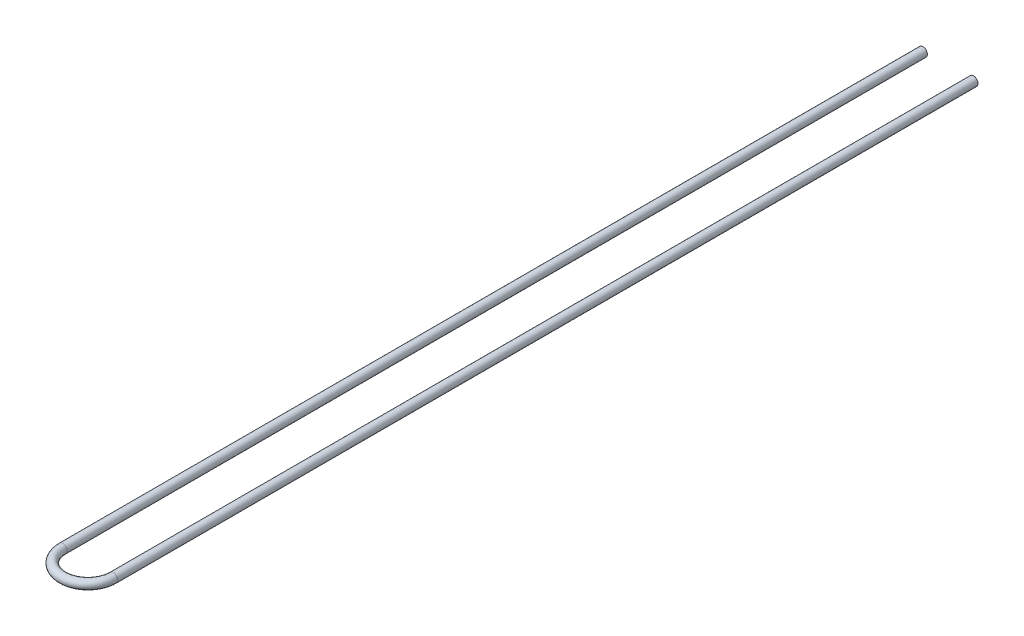
ISO-10303-21;
HEADER;
FILE_DESCRIPTION(('STEP AP214'),'2;1');
FILE_NAME('part.step','',(''),(''),'','','');
FILE_SCHEMA(('AUTOMOTIVE_DESIGN { 1 0 10303 214 1 1 1 1 }'));
ENDSEC;
DATA;
#1=APPLICATION_CONTEXT('core data for automotive mechanical design processes');
#2=APPLICATION_PROTOCOL_DEFINITION('international standard','automotive_design',2000,#1);
#3=PRODUCT_CONTEXT('',#1,'mechanical');
#4=PRODUCT('Part','Part','',(#3));
#5=PRODUCT_RELATED_PRODUCT_CATEGORY('part','',(#4));
#6=PRODUCT_DEFINITION_FORMATION('','',#4);
#7=PRODUCT_DEFINITION_CONTEXT('part definition',#1,'design');
#8=PRODUCT_DEFINITION('design','',#6,#7);
#9=PRODUCT_DEFINITION_SHAPE('','',#8);
#10=(LENGTH_UNIT() NAMED_UNIT(*) SI_UNIT(.MILLI.,.METRE.));
#11=(NAMED_UNIT(*) PLANE_ANGLE_UNIT() SI_UNIT($,.RADIAN.));
#12=(NAMED_UNIT(*) SI_UNIT($,.STERADIAN.) SOLID_ANGLE_UNIT());
#13=UNCERTAINTY_MEASURE_WITH_UNIT(LENGTH_MEASURE(1.E-05),#10,'distance_accuracy_value','');
#14=(GEOMETRIC_REPRESENTATION_CONTEXT(3) GLOBAL_UNCERTAINTY_ASSIGNED_CONTEXT((#13)) GLOBAL_UNIT_ASSIGNED_CONTEXT((#10,
#11,#12)) REPRESENTATION_CONTEXT('',''));
#15=CARTESIAN_POINT('',(0.,0.,0.));
#16=DIRECTION('',(0.,0.,1.));
#17=DIRECTION('',(1.,0.,0.));
#18=AXIS2_PLACEMENT_3D('',#15,#16,#17);
#19=CARTESIAN_POINT('',(-40.,0.,299.999999999999));
#20=DIRECTION('',(0.,0.,1.));
#21=DIRECTION('',(1.,0.,0.));
#22=AXIS2_PLACEMENT_3D('',#19,#20,#21);
#23=CYLINDRICAL_SURFACE('',#22,11.1);
#24=CARTESIAN_POINT('',(-39.9999999999997,0.,2440.));
#25=DIRECTION('',(0.,0.,1.));
#26=DIRECTION('',(1.,0.,0.));
#27=AXIS2_PLACEMENT_3D('',#24,#25,#26);
#28=CIRCLE('',#27,11.1);
#29=CARTESIAN_POINT('',(-51.0999999999997,0.,2440.));
#30=VERTEX_POINT('',#29);
#31=EDGE_CURVE('E52',#30,#30,#28,.T.);
#32=ORIENTED_EDGE('',*,*,#31,.F.);
#33=EDGE_LOOP('',(#32));
#34=FACE_BOUND('',#33,.T.);
#35=CARTESIAN_POINT('',(-40.,0.,299.999999999999));
#36=DIRECTION('',(0.,0.,1.));
#37=DIRECTION('',(1.,0.,0.));
#38=AXIS2_PLACEMENT_3D('',#35,#36,#37);
#39=CIRCLE('',#38,11.1);
#40=CARTESIAN_POINT('',(-28.9,0.,299.999999999999));
#41=VERTEX_POINT('',#40);
#42=EDGE_CURVE('E50',#41,#41,#39,.T.);
#43=ORIENTED_EDGE('',*,*,#42,.T.);
#44=EDGE_LOOP('',(#43));
#45=FACE_BOUND('',#44,.T.);
#46=ADVANCED_FACE('F29',(#34,#45),#23,.T.);
#47=CARTESIAN_POINT('',(22.9250000000003,0.,2440.));
#48=DIRECTION('',(0.,1.,0.));
#49=DIRECTION('',(0.,0.,1.));
#50=AXIS2_PLACEMENT_3D('',#47,#48,#49);
#51=TOROIDAL_SURFACE('',#50,62.925,11.1);
#52=CARTESIAN_POINT('',(85.8500000000003,0.,2440.));
#53=DIRECTION('',(0.,0.,-1.));
#54=DIRECTION('',(-1.,0.,0.));
#55=AXIS2_PLACEMENT_3D('',#52,#53,#54);
#56=CIRCLE('',#55,11.1);
#57=CARTESIAN_POINT('',(96.9500000000003,0.,2440.));
#58=VERTEX_POINT('',#57);
#59=EDGE_CURVE('E33',#58,#58,#56,.T.);
#60=CARTESIAN_POINT('',(22.9250000000003,0.,2440.));
#61=DIRECTION('',(0.,1.,0.));
#62=DIRECTION('',(0.,0.,1.));
#63=AXIS2_PLACEMENT_3D('',#60,#61,#62);
#64=CIRCLE('',#63,74.025);
#65=EDGE_CURVE('',#30,#58,#64,.T.);
#66=ORIENTED_EDGE('',*,*,#31,.T.);
#67=ORIENTED_EDGE('',*,*,#59,.F.);
#68=ORIENTED_EDGE('',*,*,#65,.T.);
#69=ORIENTED_EDGE('',*,*,#65,.F.);
#70=EDGE_LOOP('',(#66,#68,#67,#69));
#71=FACE_BOUND('',#70,.T.);
#72=ADVANCED_FACE('F60',(#71),#51,.T.);
#73=CARTESIAN_POINT('',(85.8500000000003,0.,2440.));
#74=DIRECTION('',(0.,0.,-1.));
#75=DIRECTION('',(-1.,0.,0.));
#76=AXIS2_PLACEMENT_3D('',#73,#74,#75);
#77=CYLINDRICAL_SURFACE('',#76,11.1);
#78=CARTESIAN_POINT('',(85.85,0.,299.999999999999));
#79=DIRECTION('',(0.,0.,-1.));
#80=DIRECTION('',(-1.,0.,0.));
#81=AXIS2_PLACEMENT_3D('',#78,#79,#80);
#82=CIRCLE('',#81,11.1);
#83=CARTESIAN_POINT('',(74.75,0.,299.999999999999));
#84=VERTEX_POINT('',#83);
#85=EDGE_CURVE('E46',#84,#84,#82,.T.);
#86=ORIENTED_EDGE('',*,*,#85,.F.);
#87=EDGE_LOOP('',(#86));
#88=FACE_BOUND('',#87,.T.);
#89=ORIENTED_EDGE('',*,*,#59,.T.);
#90=EDGE_LOOP('',(#89));
#91=FACE_BOUND('',#90,.T.);
#92=ADVANCED_FACE('F31',(#88,#91),#77,.T.);
#93=CARTESIAN_POINT('',(-40.,0.,299.999999999999));
#94=DIRECTION('',(0.,0.,1.));
#95=DIRECTION('',(1.,0.,0.));
#96=AXIS2_PLACEMENT_3D('',#93,#94,#95);
#97=PLANE('',#96);
#98=CARTESIAN_POINT('',(-40.,0.,299.999999999999));
#99=DIRECTION('',(0.,0.,1.));
#100=DIRECTION('',(1.,0.,0.));
#101=AXIS2_PLACEMENT_3D('',#98,#99,#100);
#102=CIRCLE('',#101,9.95);
#103=CARTESIAN_POINT('',(-30.05,0.,299.999999999999));
#104=VERTEX_POINT('',#103);
#105=EDGE_CURVE('E49',#104,#104,#102,.F.);
#106=ORIENTED_EDGE('',*,*,#105,.F.);
#107=EDGE_LOOP('',(#106));
#108=FACE_BOUND('',#107,.T.);
#109=ORIENTED_EDGE('',*,*,#42,.F.);
#110=EDGE_LOOP('',(#109));
#111=FACE_BOUND('',#110,.T.);
#112=ADVANCED_FACE('F66',(#108,#111),#97,.F.);
#113=CARTESIAN_POINT('',(85.85,0.,299.999999999999));
#114=DIRECTION('',(0.,0.,-1.));
#115=DIRECTION('',(-1.,0.,0.));
#116=AXIS2_PLACEMENT_3D('',#113,#114,#115);
#117=PLANE('',#116);
#118=CARTESIAN_POINT('',(85.85,0.,299.999999999999));
#119=DIRECTION('',(0.,0.,-1.));
#120=DIRECTION('',(-1.,0.,0.));
#121=AXIS2_PLACEMENT_3D('',#118,#119,#120);
#122=CIRCLE('',#121,9.95);
#123=CARTESIAN_POINT('',(75.9,0.,299.999999999999));
#124=VERTEX_POINT('',#123);
#125=EDGE_CURVE('E10',#124,#124,#122,.F.);
#126=ORIENTED_EDGE('',*,*,#125,.T.);
#127=EDGE_LOOP('',(#126));
#128=FACE_BOUND('',#127,.T.);
#129=ORIENTED_EDGE('',*,*,#85,.T.);
#130=EDGE_LOOP('',(#129));
#131=FACE_BOUND('',#130,.T.);
#132=ADVANCED_FACE('F84',(#128,#131),#117,.T.);
#133=CARTESIAN_POINT('',(-40.,0.,299.999999999999));
#134=DIRECTION('',(0.,0.,1.));
#135=DIRECTION('',(1.,0.,0.));
#136=AXIS2_PLACEMENT_3D('',#133,#134,#135);
#137=CYLINDRICAL_SURFACE('',#136,9.95);
#138=CARTESIAN_POINT('',(-39.9999999999997,0.,2440.));
#139=DIRECTION('',(0.,0.,1.));
#140=DIRECTION('',(1.,0.,0.));
#141=AXIS2_PLACEMENT_3D('',#138,#139,#140);
#142=CIRCLE('',#141,9.95);
#143=CARTESIAN_POINT('',(-49.9499999999997,0.,2440.));
#144=VERTEX_POINT('',#143);
#145=EDGE_CURVE('E42',#144,#144,#142,.F.);
#146=ORIENTED_EDGE('',*,*,#145,.F.);
#147=EDGE_LOOP('',(#146));
#148=FACE_BOUND('',#147,.T.);
#149=ORIENTED_EDGE('',*,*,#105,.T.);
#150=EDGE_LOOP('',(#149));
#151=FACE_BOUND('',#150,.T.);
#152=ADVANCED_FACE('F78',(#148,#151),#137,.F.);
#153=CARTESIAN_POINT('',(22.9250000000003,0.,2440.));
#154=DIRECTION('',(0.,1.,0.));
#155=DIRECTION('',(0.,0.,1.));
#156=AXIS2_PLACEMENT_3D('',#153,#154,#155);
#157=TOROIDAL_SURFACE('',#156,62.925,9.95);
#158=CARTESIAN_POINT('',(85.8500000000003,0.,2440.));
#159=DIRECTION('',(0.,0.,-1.));
#160=DIRECTION('',(-1.,0.,0.));
#161=AXIS2_PLACEMENT_3D('',#158,#159,#160);
#162=CIRCLE('',#161,9.95);
#163=CARTESIAN_POINT('',(95.8000000000003,0.,2440.));
#164=VERTEX_POINT('',#163);
#165=EDGE_CURVE('E37',#164,#164,#162,.F.);
#166=CARTESIAN_POINT('',(22.9250000000003,0.,2440.));
#167=DIRECTION('',(0.,1.,0.));
#168=DIRECTION('',(0.,0.,1.));
#169=AXIS2_PLACEMENT_3D('',#166,#167,#168);
#170=CIRCLE('',#169,72.875);
#171=EDGE_CURVE('',#144,#164,#170,.T.);
#172=ORIENTED_EDGE('',*,*,#145,.T.);
#173=ORIENTED_EDGE('',*,*,#165,.F.);
#174=ORIENTED_EDGE('',*,*,#171,.T.);
#175=ORIENTED_EDGE('',*,*,#171,.F.);
#176=EDGE_LOOP('',(#172,#174,#173,#175));
#177=FACE_BOUND('',#176,.T.);
#178=ADVANCED_FACE('F72',(#177),#157,.F.);
#179=CARTESIAN_POINT('',(85.8500000000003,0.,2440.));
#180=DIRECTION('',(0.,0.,-1.));
#181=DIRECTION('',(-1.,0.,0.));
#182=AXIS2_PLACEMENT_3D('',#179,#180,#181);
#183=CYLINDRICAL_SURFACE('',#182,9.95);
#184=ORIENTED_EDGE('',*,*,#125,.F.);
#185=EDGE_LOOP('',(#184));
#186=FACE_BOUND('',#185,.T.);
#187=ORIENTED_EDGE('',*,*,#165,.T.);
#188=EDGE_LOOP('',(#187));
#189=FACE_BOUND('',#188,.T.);
#190=ADVANCED_FACE('F70',(#186,#189),#183,.F.);
#191=CLOSED_SHELL('',(#46,#72,#92,#112,#132,#152,#178,#190));
#192=MANIFOLD_SOLID_BREP('B2',#191);
#193=ADVANCED_BREP_SHAPE_REPRESENTATION('',(#18,#192),#14);
#194=SHAPE_DEFINITION_REPRESENTATION(#9,#193);
ENDSEC;
END-ISO-10303-21;
